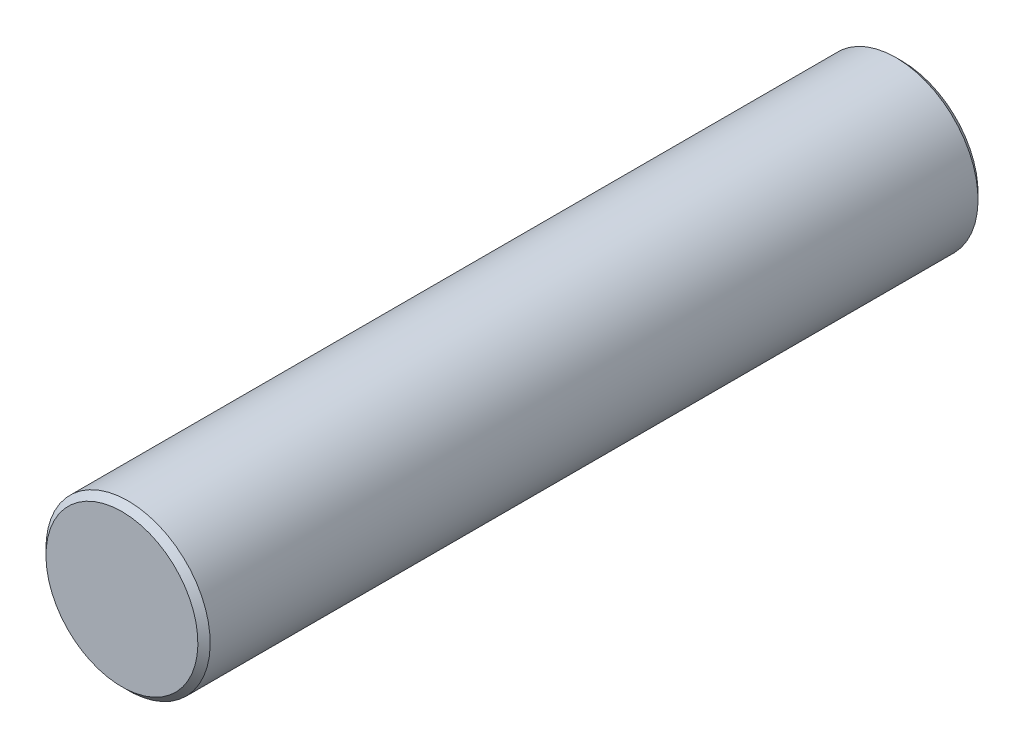
ISO-10303-21;
HEADER;
FILE_DESCRIPTION(('STEP AP214'),'2;1');
FILE_NAME('part.step','',(''),(''),'','','');
FILE_SCHEMA(('AUTOMOTIVE_DESIGN { 1 0 10303 214 1 1 1 1 }'));
ENDSEC;
DATA;
#1=APPLICATION_CONTEXT('core data for automotive mechanical design processes');
#2=APPLICATION_PROTOCOL_DEFINITION('international standard','automotive_design',2000,#1);
#3=PRODUCT_CONTEXT('',#1,'mechanical');
#4=PRODUCT('Part','Part','',(#3));
#5=PRODUCT_RELATED_PRODUCT_CATEGORY('part','',(#4));
#6=PRODUCT_DEFINITION_FORMATION('','',#4);
#7=PRODUCT_DEFINITION_CONTEXT('part definition',#1,'design');
#8=PRODUCT_DEFINITION('design','',#6,#7);
#9=PRODUCT_DEFINITION_SHAPE('','',#8);
#10=(LENGTH_UNIT() NAMED_UNIT(*) SI_UNIT(.MILLI.,.METRE.));
#11=(NAMED_UNIT(*) PLANE_ANGLE_UNIT() SI_UNIT($,.RADIAN.));
#12=(NAMED_UNIT(*) SI_UNIT($,.STERADIAN.) SOLID_ANGLE_UNIT());
#13=UNCERTAINTY_MEASURE_WITH_UNIT(LENGTH_MEASURE(1.E-05),#10,'distance_accuracy_value','');
#14=(GEOMETRIC_REPRESENTATION_CONTEXT(3) GLOBAL_UNCERTAINTY_ASSIGNED_CONTEXT((#13)) GLOBAL_UNIT_ASSIGNED_CONTEXT((#10,
#11,#12)) REPRESENTATION_CONTEXT('',''));
#15=CARTESIAN_POINT('',(0.,0.,0.));
#16=DIRECTION('',(0.,0.,1.));
#17=DIRECTION('',(1.,0.,0.));
#18=AXIS2_PLACEMENT_3D('',#15,#16,#17);
#19=CARTESIAN_POINT('',(0.,9.25,0.));
#20=DIRECTION('',(0.,0.,-1.));
#21=DIRECTION('',(0.,1.,0.));
#22=AXIS2_PLACEMENT_3D('',#19,#20,#21);
#23=PLANE('',#22);
#24=CARTESIAN_POINT('',(0.,0.,0.));
#25=DIRECTION('',(0.,0.,-1.));
#26=DIRECTION('',(0.,1.,0.));
#27=AXIS2_PLACEMENT_3D('',#24,#25,#26);
#28=CIRCLE('',#27,18.5);
#29=CARTESIAN_POINT('',(0.,18.5,0.));
#30=VERTEX_POINT('',#29);
#31=EDGE_CURVE('E9',#30,#30,#28,.T.);
#32=ORIENTED_EDGE('',*,*,#31,.T.);
#33=EDGE_LOOP('',(#32));
#34=FACE_BOUND('',#33,.T.);
#35=CARTESIAN_POINT('',(0.,0.,0.));
#36=DIRECTION('',(0.,0.,1.));
#37=DIRECTION('',(-1.,0.,0.));
#38=AXIS2_PLACEMENT_3D('',#35,#36,#37);
#39=CIRCLE('',#38,6.);
#40=CARTESIAN_POINT('',(-6.,0.,0.));
#41=VERTEX_POINT('',#40);
#42=EDGE_CURVE('E52',#41,#41,#39,.T.);
#43=ORIENTED_EDGE('',*,*,#42,.T.);
#44=EDGE_LOOP('',(#43));
#45=FACE_BOUND('',#44,.T.);
#46=ADVANCED_FACE('F15',(#34,#45),#23,.T.);
#47=CARTESIAN_POINT('',(0.,0.,0.75));
#48=DIRECTION('',(0.,0.,1.));
#49=DIRECTION('',(0.,1.,0.));
#50=AXIS2_PLACEMENT_3D('',#47,#48,#49);
#51=CONICAL_SURFACE('',#50,19.25,0.785398163397448);
#52=CARTESIAN_POINT('',(0.,0.,1.5));
#53=DIRECTION('',(0.,0.,-1.));
#54=DIRECTION('',(0.,1.,0.));
#55=AXIS2_PLACEMENT_3D('',#52,#53,#54);
#56=CIRCLE('',#55,20.);
#57=CARTESIAN_POINT('',(0.,20.,1.5));
#58=VERTEX_POINT('',#57);
#59=EDGE_CURVE('E25',#58,#58,#56,.T.);
#60=ORIENTED_EDGE('',*,*,#59,.T.);
#61=EDGE_LOOP('',(#60));
#62=FACE_BOUND('',#61,.T.);
#63=ORIENTED_EDGE('',*,*,#31,.F.);
#64=EDGE_LOOP('',(#63));
#65=FACE_BOUND('',#64,.T.);
#66=ADVANCED_FACE('F121',(#62,#65),#51,.T.);
#67=CARTESIAN_POINT('',(0.,0.,95.));
#68=DIRECTION('',(0.,0.,1.));
#69=DIRECTION('',(0.,1.,0.));
#70=AXIS2_PLACEMENT_3D('',#67,#68,#69);
#71=CYLINDRICAL_SURFACE('',#70,20.);
#72=CARTESIAN_POINT('',(0.,0.,188.5));
#73=DIRECTION('',(0.,0.,-1.));
#74=DIRECTION('',(0.,1.,0.));
#75=AXIS2_PLACEMENT_3D('',#72,#73,#74);
#76=CIRCLE('',#75,20.);
#77=CARTESIAN_POINT('',(0.,20.,188.5));
#78=VERTEX_POINT('',#77);
#79=EDGE_CURVE('E19',#78,#78,#76,.T.);
#80=ORIENTED_EDGE('',*,*,#79,.T.);
#81=EDGE_LOOP('',(#80));
#82=FACE_BOUND('',#81,.T.);
#83=ORIENTED_EDGE('',*,*,#59,.F.);
#84=EDGE_LOOP('',(#83));
#85=FACE_BOUND('',#84,.T.);
#86=CARTESIAN_POINT('',(0.,0.,6.5));
#87=DIRECTION('',(0.,0.,-1.));
#88=DIRECTION('',(0.,1.,0.));
#89=AXIS2_PLACEMENT_3D('',#86,#87,#88);
#90=CIRCLE('',#89,20.);
#91=CARTESIAN_POINT('',(10.5356537528527,-17.,6.5));
#92=VERTEX_POINT('',#91);
#93=CARTESIAN_POINT('',(-10.5356537528527,-17.,6.5));
#94=VERTEX_POINT('',#93);
#95=EDGE_CURVE('E69',#92,#94,#90,.T.);
#96=ORIENTED_EDGE('',*,*,#95,.T.);
#97=DIRECTION('',(0.,0.,1.));
#98=VECTOR('',#97,1.);
#99=CARTESIAN_POINT('',(-10.5356537528527,-17.,8.25));
#100=LINE('',#99,#98);
#101=CARTESIAN_POINT('',(-10.5356537528527,-17.,10.));
#102=VERTEX_POINT('',#101);
#103=EDGE_CURVE('E62',#94,#102,#100,.T.);
#104=ORIENTED_EDGE('',*,*,#103,.T.);
#105=CARTESIAN_POINT('',(0.,0.,10.));
#106=DIRECTION('',(0.,0.,1.));
#107=DIRECTION('',(0.,1.,0.));
#108=AXIS2_PLACEMENT_3D('',#105,#106,#107);
#109=CIRCLE('',#108,20.);
#110=CARTESIAN_POINT('',(10.5356537528527,-17.,10.));
#111=VERTEX_POINT('',#110);
#112=EDGE_CURVE('E75',#102,#111,#109,.T.);
#113=ORIENTED_EDGE('',*,*,#112,.T.);
#114=DIRECTION('',(0.,0.,-1.));
#115=VECTOR('',#114,1.);
#116=CARTESIAN_POINT('',(10.5356537528527,-17.,8.25));
#117=LINE('',#116,#115);
#118=EDGE_CURVE('E60',#111,#92,#117,.T.);
#119=ORIENTED_EDGE('',*,*,#118,.T.);
#120=EDGE_LOOP('',(#96,#104,#113,#119));
#121=FACE_BOUND('',#120,.T.);
#122=ADVANCED_FACE('F17',(#82,#85,#121),#71,.T.);
#123=CARTESIAN_POINT('',(0.,0.,189.25));
#124=DIRECTION('',(0.,0.,-1.));
#125=DIRECTION('',(0.,1.,0.));
#126=AXIS2_PLACEMENT_3D('',#123,#124,#125);
#127=CONICAL_SURFACE('',#126,19.25,0.785398163397448);
#128=CARTESIAN_POINT('',(0.,0.,190.));
#129=DIRECTION('',(0.,0.,-1.));
#130=DIRECTION('',(0.,1.,0.));
#131=AXIS2_PLACEMENT_3D('',#128,#129,#130);
#132=CIRCLE('',#131,18.5);
#133=CARTESIAN_POINT('',(0.,18.5,190.));
#134=VERTEX_POINT('',#133);
#135=EDGE_CURVE('E44',#134,#134,#132,.T.);
#136=ORIENTED_EDGE('',*,*,#135,.T.);
#137=EDGE_LOOP('',(#136));
#138=FACE_BOUND('',#137,.T.);
#139=ORIENTED_EDGE('',*,*,#79,.F.);
#140=EDGE_LOOP('',(#139));
#141=FACE_BOUND('',#140,.T.);
#142=ADVANCED_FACE('F116',(#138,#141),#127,.T.);
#143=CARTESIAN_POINT('',(0.,9.25,190.));
#144=DIRECTION('',(0.,0.,1.));
#145=DIRECTION('',(0.,-1.,0.));
#146=AXIS2_PLACEMENT_3D('',#143,#144,#145);
#147=PLANE('',#146);
#148=ORIENTED_EDGE('',*,*,#135,.F.);
#149=EDGE_LOOP('',(#148));
#150=FACE_BOUND('',#149,.T.);
#151=ADVANCED_FACE('F110',(#150),#147,.T.);
#152=CARTESIAN_POINT('',(0.,0.,26.4586213285198));
#153=DIRECTION('',(0.,0.,-1.));
#154=DIRECTION('',(-1.,0.,0.));
#155=AXIS2_PLACEMENT_3D('',#152,#153,#154);
#156=CONICAL_SURFACE('',#155,2.52640625,1.0471975511966);
#157=CARTESIAN_POINT('',(0.,0.,25.));
#158=DIRECTION('',(0.,0.,1.));
#159=DIRECTION('',(-1.,0.,0.));
#160=AXIS2_PLACEMENT_3D('',#157,#158,#159);
#161=CIRCLE('',#160,5.0528125);
#162=CARTESIAN_POINT('',(-5.0528125,0.,25.));
#163=VERTEX_POINT('',#162);
#164=EDGE_CURVE('E51',#163,#163,#161,.T.);
#165=ORIENTED_EDGE('',*,*,#164,.F.);
#166=EDGE_LOOP('',(#165));
#167=FACE_BOUND('',#166,.T.);
#168=CARTESIAN_POINT('',(0.,0.,27.9172426570397));
#169=VERTEX_POINT('',#168);
#170=VERTEX_LOOP('',#169);
#171=FACE_BOUND('',#170,.T.);
#172=ADVANCED_FACE('F104',(#167,#171),#156,.F.);
#173=CARTESIAN_POINT('',(0.,0.,12.97359375));
#174=DIRECTION('',(0.,0.,-1.));
#175=DIRECTION('',(-1.,0.,0.));
#176=AXIS2_PLACEMENT_3D('',#173,#174,#175);
#177=CYLINDRICAL_SURFACE('',#176,5.0528125);
#178=CARTESIAN_POINT('',(0.,0.,0.9471875));
#179=DIRECTION('',(0.,0.,1.));
#180=DIRECTION('',(-1.,0.,0.));
#181=AXIS2_PLACEMENT_3D('',#178,#179,#180);
#182=CIRCLE('',#181,5.0528125);
#183=CARTESIAN_POINT('',(-5.0528125,0.,0.9471875));
#184=VERTEX_POINT('',#183);
#185=EDGE_CURVE('E57',#184,#184,#182,.T.);
#186=ORIENTED_EDGE('',*,*,#185,.F.);
#187=EDGE_LOOP('',(#186));
#188=FACE_BOUND('',#187,.T.);
#189=ORIENTED_EDGE('',*,*,#164,.T.);
#190=EDGE_LOOP('',(#189));
#191=FACE_BOUND('',#190,.T.);
#192=ADVANCED_FACE('F101',(#188,#191),#177,.F.);
#193=CARTESIAN_POINT('',(0.,0.,0.47359375));
#194=DIRECTION('',(0.,0.,-1.));
#195=DIRECTION('',(-1.,0.,0.));
#196=AXIS2_PLACEMENT_3D('',#193,#194,#195);
#197=CONICAL_SURFACE('',#196,5.52640625,0.785398163397448);
#198=ORIENTED_EDGE('',*,*,#42,.F.);
#199=EDGE_LOOP('',(#198));
#200=FACE_BOUND('',#199,.T.);
#201=ORIENTED_EDGE('',*,*,#185,.T.);
#202=EDGE_LOOP('',(#201));
#203=FACE_BOUND('',#202,.T.);
#204=ADVANCED_FACE('F99',(#200,#203),#197,.F.);
#205=CARTESIAN_POINT('',(0.,-17.,8.25));
#206=DIRECTION('',(0.,-1.,0.));
#207=DIRECTION('',(0.,0.,-1.));
#208=AXIS2_PLACEMENT_3D('',#205,#206,#207);
#209=PLANE('',#208);
#210=ORIENTED_EDGE('',*,*,#103,.F.);
#211=DIRECTION('',(1.,0.,0.));
#212=VECTOR('',#211,1.);
#213=CARTESIAN_POINT('',(0.,-17.,6.5));
#214=LINE('',#213,#212);
#215=EDGE_CURVE('E66',#94,#92,#214,.T.);
#216=ORIENTED_EDGE('',*,*,#215,.T.);
#217=ORIENTED_EDGE('',*,*,#118,.F.);
#218=DIRECTION('',(-1.,0.,0.));
#219=VECTOR('',#218,1.);
#220=CARTESIAN_POINT('',(0.,-17.,10.));
#221=LINE('',#220,#219);
#222=EDGE_CURVE('E72',#111,#102,#221,.T.);
#223=ORIENTED_EDGE('',*,*,#222,.T.);
#224=EDGE_LOOP('',(#210,#216,#217,#223));
#225=FACE_BOUND('',#224,.T.);
#226=ADVANCED_FACE('F131',(#225),#209,.T.);
#227=CARTESIAN_POINT('',(0.,-19.5,6.5));
#228=DIRECTION('',(0.,0.,1.));
#229=DIRECTION('',(1.,0.,0.));
#230=AXIS2_PLACEMENT_3D('',#227,#228,#229);
#231=PLANE('',#230);
#232=ORIENTED_EDGE('',*,*,#95,.F.);
#233=ORIENTED_EDGE('',*,*,#215,.F.);
#234=EDGE_LOOP('',(#232,#233));
#235=FACE_BOUND('',#234,.T.);
#236=ADVANCED_FACE('F135',(#235),#231,.T.);
#237=CARTESIAN_POINT('',(0.,-19.5,10.));
#238=DIRECTION('',(0.,0.,1.));
#239=DIRECTION('',(1.,0.,0.));
#240=AXIS2_PLACEMENT_3D('',#237,#238,#239);
#241=PLANE('',#240);
#242=ORIENTED_EDGE('',*,*,#112,.F.);
#243=ORIENTED_EDGE('',*,*,#222,.F.);
#244=EDGE_LOOP('',(#242,#243));
#245=FACE_BOUND('',#244,.T.);
#246=ADVANCED_FACE('F87',(#245),#241,.F.);
#247=CLOSED_SHELL('',(#46,#66,#122,#142,#151,#172,#192,#204,#226,#236,#246));
#248=MANIFOLD_SOLID_BREP('B1',#247);
#249=ADVANCED_BREP_SHAPE_REPRESENTATION('',(#18,#248),#14);
#250=SHAPE_DEFINITION_REPRESENTATION(#9,#249);
ENDSEC;
END-ISO-10303-21;
